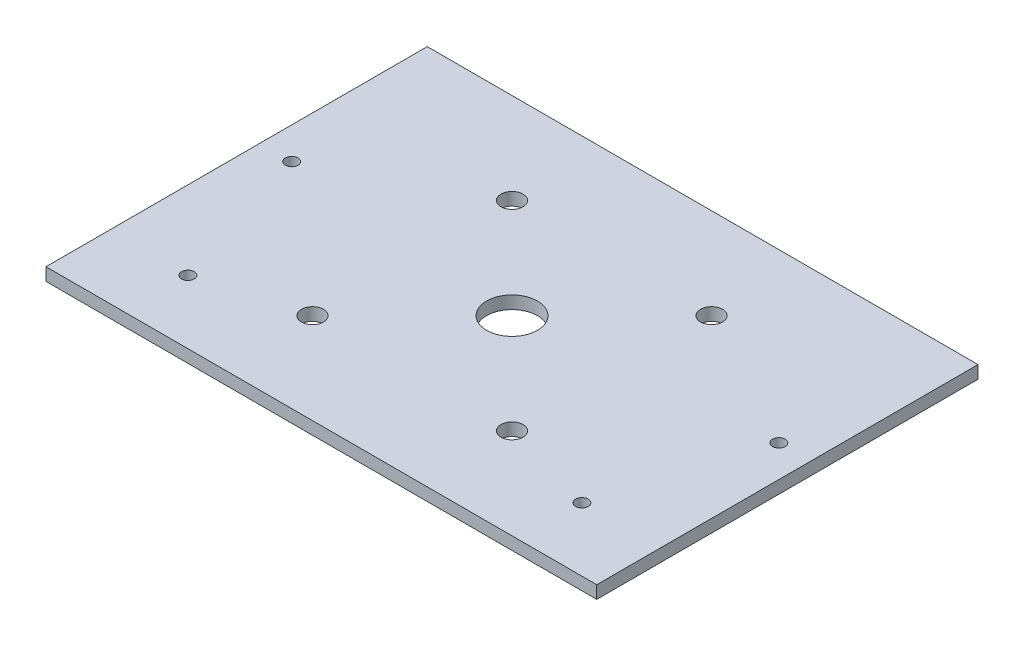
ISO-10303-21;
HEADER;
FILE_DESCRIPTION(('STEP AP214'),'2;1');
FILE_NAME('part.step','',(''),(''),'','','');
FILE_SCHEMA(('AUTOMOTIVE_DESIGN { 1 0 10303 214 1 1 1 1 }'));
ENDSEC;
DATA;
#1=APPLICATION_CONTEXT('core data for automotive mechanical design processes');
#2=APPLICATION_PROTOCOL_DEFINITION('international standard','automotive_design',2000,#1);
#3=PRODUCT_CONTEXT('',#1,'mechanical');
#4=PRODUCT('Part','Part','',(#3));
#5=PRODUCT_RELATED_PRODUCT_CATEGORY('part','',(#4));
#6=PRODUCT_DEFINITION_FORMATION('','',#4);
#7=PRODUCT_DEFINITION_CONTEXT('part definition',#1,'design');
#8=PRODUCT_DEFINITION('design','',#6,#7);
#9=PRODUCT_DEFINITION_SHAPE('','',#8);
#10=(LENGTH_UNIT() NAMED_UNIT(*) SI_UNIT(.MILLI.,.METRE.));
#11=(NAMED_UNIT(*) PLANE_ANGLE_UNIT() SI_UNIT($,.RADIAN.));
#12=(NAMED_UNIT(*) SI_UNIT($,.STERADIAN.) SOLID_ANGLE_UNIT());
#13=UNCERTAINTY_MEASURE_WITH_UNIT(LENGTH_MEASURE(1.E-05),#10,'distance_accuracy_value','');
#14=(GEOMETRIC_REPRESENTATION_CONTEXT(3) GLOBAL_UNCERTAINTY_ASSIGNED_CONTEXT((#13)) GLOBAL_UNIT_ASSIGNED_CONTEXT((#10,
#11,#12)) REPRESENTATION_CONTEXT('',''));
#15=CARTESIAN_POINT('',(0.,0.,0.));
#16=DIRECTION('',(0.,0.,1.));
#17=DIRECTION('',(1.,0.,0.));
#18=AXIS2_PLACEMENT_3D('',#15,#16,#17);
#19=CARTESIAN_POINT('',(65.,3.,-45.));
#20=DIRECTION('',(-1.,0.,0.));
#21=DIRECTION('',(0.,0.,1.));
#22=AXIS2_PLACEMENT_3D('',#19,#20,#21);
#23=PLANE('',#22);
#24=DIRECTION('',(0.,0.,-1.));
#25=VECTOR('',#24,1.);
#26=CARTESIAN_POINT('',(65.,0.,-45.));
#27=LINE('',#26,#25);
#28=CARTESIAN_POINT('',(65.,0.,45.));
#29=VERTEX_POINT('',#28);
#30=CARTESIAN_POINT('',(65.,0.,-45.));
#31=VERTEX_POINT('',#30);
#32=EDGE_CURVE('E99',#29,#31,#27,.T.);
#33=ORIENTED_EDGE('',*,*,#32,.T.);
#34=DIRECTION('',(0.,-1.,0.));
#35=VECTOR('',#34,1.);
#36=CARTESIAN_POINT('',(65.,3.,-45.));
#37=LINE('',#36,#35);
#38=CARTESIAN_POINT('',(65.,3.,-45.));
#39=VERTEX_POINT('',#38);
#40=EDGE_CURVE('E11',#39,#31,#37,.T.);
#41=ORIENTED_EDGE('',*,*,#40,.F.);
#42=DIRECTION('',(0.,0.,-1.));
#43=VECTOR('',#42,1.);
#44=CARTESIAN_POINT('',(65.,3.,-45.));
#45=LINE('',#44,#43);
#46=CARTESIAN_POINT('',(65.,3.,45.));
#47=VERTEX_POINT('',#46);
#48=EDGE_CURVE('E86',#47,#39,#45,.T.);
#49=ORIENTED_EDGE('',*,*,#48,.F.);
#50=DIRECTION('',(0.,-1.,0.));
#51=VECTOR('',#50,1.);
#52=CARTESIAN_POINT('',(65.,3.,45.));
#53=LINE('',#52,#51);
#54=EDGE_CURVE('E95',#47,#29,#53,.T.);
#55=ORIENTED_EDGE('',*,*,#54,.T.);
#56=EDGE_LOOP('',(#33,#41,#49,#55));
#57=FACE_BOUND('',#56,.T.);
#58=ADVANCED_FACE('F33',(#57),#23,.F.);
#59=CARTESIAN_POINT('',(-65.,3.,-45.));
#60=DIRECTION('',(0.,0.,1.));
#61=DIRECTION('',(1.,0.,0.));
#62=AXIS2_PLACEMENT_3D('',#59,#60,#61);
#63=PLANE('',#62);
#64=DIRECTION('',(-1.,0.,0.));
#65=VECTOR('',#64,1.);
#66=CARTESIAN_POINT('',(-65.,0.,-45.));
#67=LINE('',#66,#65);
#68=CARTESIAN_POINT('',(-65.,0.,-45.));
#69=VERTEX_POINT('',#68);
#70=EDGE_CURVE('E90',#31,#69,#67,.T.);
#71=ORIENTED_EDGE('',*,*,#70,.T.);
#72=DIRECTION('',(0.,-1.,0.));
#73=VECTOR('',#72,1.);
#74=CARTESIAN_POINT('',(-65.,3.,-45.));
#75=LINE('',#74,#73);
#76=CARTESIAN_POINT('',(-65.,3.,-45.));
#77=VERTEX_POINT('',#76);
#78=EDGE_CURVE('E42',#77,#69,#75,.T.);
#79=ORIENTED_EDGE('',*,*,#78,.F.);
#80=DIRECTION('',(-1.,0.,0.));
#81=VECTOR('',#80,1.);
#82=CARTESIAN_POINT('',(-65.,3.,-45.));
#83=LINE('',#82,#81);
#84=EDGE_CURVE('E81',#39,#77,#83,.T.);
#85=ORIENTED_EDGE('',*,*,#84,.F.);
#86=ORIENTED_EDGE('',*,*,#40,.T.);
#87=EDGE_LOOP('',(#71,#79,#85,#86));
#88=FACE_BOUND('',#87,.T.);
#89=ADVANCED_FACE('F89',(#88),#63,.F.);
#90=CARTESIAN_POINT('',(-65.,3.,-45.));
#91=DIRECTION('',(1.,0.,0.));
#92=DIRECTION('',(0.,0.,-1.));
#93=AXIS2_PLACEMENT_3D('',#90,#91,#92);
#94=PLANE('',#93);
#95=DIRECTION('',(0.,0.,1.));
#96=VECTOR('',#95,1.);
#97=CARTESIAN_POINT('',(-65.,0.,-45.));
#98=LINE('',#97,#96);
#99=CARTESIAN_POINT('',(-65.,0.,45.));
#100=VERTEX_POINT('',#99);
#101=EDGE_CURVE('E68',#69,#100,#98,.T.);
#102=ORIENTED_EDGE('',*,*,#101,.T.);
#103=DIRECTION('',(0.,-1.,0.));
#104=VECTOR('',#103,1.);
#105=CARTESIAN_POINT('',(-65.,3.,45.));
#106=LINE('',#105,#104);
#107=CARTESIAN_POINT('',(-65.,3.,45.));
#108=VERTEX_POINT('',#107);
#109=EDGE_CURVE('E91',#108,#100,#106,.T.);
#110=ORIENTED_EDGE('',*,*,#109,.F.);
#111=DIRECTION('',(0.,0.,1.));
#112=VECTOR('',#111,1.);
#113=CARTESIAN_POINT('',(-65.,3.,-45.));
#114=LINE('',#113,#112);
#115=EDGE_CURVE('E84',#77,#108,#114,.T.);
#116=ORIENTED_EDGE('',*,*,#115,.F.);
#117=ORIENTED_EDGE('',*,*,#78,.T.);
#118=EDGE_LOOP('',(#102,#110,#116,#117));
#119=FACE_BOUND('',#118,.T.);
#120=ADVANCED_FACE('F93',(#119),#94,.F.);
#121=CARTESIAN_POINT('',(-65.,3.,45.));
#122=DIRECTION('',(0.,0.,-1.));
#123=DIRECTION('',(-1.,0.,0.));
#124=AXIS2_PLACEMENT_3D('',#121,#122,#123);
#125=PLANE('',#124);
#126=DIRECTION('',(1.,0.,0.));
#127=VECTOR('',#126,1.);
#128=CARTESIAN_POINT('',(-65.,0.,45.));
#129=LINE('',#128,#127);
#130=EDGE_CURVE('E74',#100,#29,#129,.T.);
#131=ORIENTED_EDGE('',*,*,#130,.T.);
#132=ORIENTED_EDGE('',*,*,#54,.F.);
#133=DIRECTION('',(1.,0.,0.));
#134=VECTOR('',#133,1.);
#135=CARTESIAN_POINT('',(-65.,3.,45.));
#136=LINE('',#135,#134);
#137=EDGE_CURVE('E51',#108,#47,#136,.T.);
#138=ORIENTED_EDGE('',*,*,#137,.F.);
#139=ORIENTED_EDGE('',*,*,#109,.T.);
#140=EDGE_LOOP('',(#131,#132,#138,#139));
#141=FACE_BOUND('',#140,.T.);
#142=ADVANCED_FACE('F138',(#141),#125,.F.);
#143=CARTESIAN_POINT('',(0.,3.,0.));
#144=DIRECTION('',(0.,1.,0.));
#145=DIRECTION('',(0.,0.,1.));
#146=AXIS2_PLACEMENT_3D('',#143,#144,#145);
#147=PLANE('',#146);
#148=CARTESIAN_POINT('',(0.,3.,0.));
#149=DIRECTION('',(0.,1.,0.));
#150=DIRECTION('',(0.,0.,1.));
#151=AXIS2_PLACEMENT_3D('',#148,#149,#150);
#152=CIRCLE('',#151,6.);
#153=CARTESIAN_POINT('',(0.,3.,6.));
#154=VERTEX_POINT('',#153);
#155=EDGE_CURVE('E270',#154,#154,#152,.T.);
#156=ORIENTED_EDGE('',*,*,#155,.F.);
#157=EDGE_LOOP('',(#156));
#158=FACE_BOUND('',#157,.T.);
#159=CARTESIAN_POINT('',(57.5,3.,-5.50000000000005));
#160=DIRECTION('',(0.,1.,0.));
#161=DIRECTION('',(0.,0.,1.));
#162=AXIS2_PLACEMENT_3D('',#159,#160,#161);
#163=CIRCLE('',#162,1.5);
#164=CARTESIAN_POINT('',(57.5,3.,-4.00000000000004));
#165=VERTEX_POINT('',#164);
#166=EDGE_CURVE('E280',#165,#165,#163,.T.);
#167=ORIENTED_EDGE('',*,*,#166,.F.);
#168=EDGE_LOOP('',(#167));
#169=FACE_BOUND('',#168,.T.);
#170=CARTESIAN_POINT('',(-57.5,3.,-5.50000000000005));
#171=DIRECTION('',(0.,1.,0.));
#172=DIRECTION('',(0.,0.,1.));
#173=AXIS2_PLACEMENT_3D('',#170,#171,#172);
#174=CIRCLE('',#173,1.5);
#175=CARTESIAN_POINT('',(-57.5,3.,-4.00000000000004));
#176=VERTEX_POINT('',#175);
#177=EDGE_CURVE('E286',#176,#176,#174,.T.);
#178=ORIENTED_EDGE('',*,*,#177,.F.);
#179=EDGE_LOOP('',(#178));
#180=FACE_BOUND('',#179,.T.);
#181=CARTESIAN_POINT('',(-46.5,3.,30.));
#182=DIRECTION('',(0.,1.,0.));
#183=DIRECTION('',(0.,0.,1.));
#184=AXIS2_PLACEMENT_3D('',#181,#182,#183);
#185=CIRCLE('',#184,1.5);
#186=CARTESIAN_POINT('',(-46.5,3.,31.5));
#187=VERTEX_POINT('',#186);
#188=EDGE_CURVE('E292',#187,#187,#185,.T.);
#189=ORIENTED_EDGE('',*,*,#188,.F.);
#190=EDGE_LOOP('',(#189));
#191=FACE_BOUND('',#190,.T.);
#192=CARTESIAN_POINT('',(46.5,3.,30.));
#193=DIRECTION('',(0.,1.,0.));
#194=DIRECTION('',(0.,0.,1.));
#195=AXIS2_PLACEMENT_3D('',#192,#193,#194);
#196=CIRCLE('',#195,1.5);
#197=CARTESIAN_POINT('',(46.5,3.,31.5));
#198=VERTEX_POINT('',#197);
#199=EDGE_CURVE('E297',#198,#198,#196,.T.);
#200=ORIENTED_EDGE('',*,*,#199,.F.);
#201=EDGE_LOOP('',(#200));
#202=FACE_BOUND('',#201,.T.);
#203=CARTESIAN_POINT('',(23.55,3.,-23.55));
#204=DIRECTION('',(0.,1.,0.));
#205=DIRECTION('',(0.,0.,1.));
#206=AXIS2_PLACEMENT_3D('',#203,#204,#205);
#207=CIRCLE('',#206,2.6);
#208=CARTESIAN_POINT('',(23.55,3.,-20.95));
#209=VERTEX_POINT('',#208);
#210=EDGE_CURVE('E126',#209,#209,#207,.T.);
#211=ORIENTED_EDGE('',*,*,#210,.F.);
#212=EDGE_LOOP('',(#211));
#213=FACE_BOUND('',#212,.T.);
#214=CARTESIAN_POINT('',(-23.55,3.,-23.55));
#215=DIRECTION('',(0.,1.,0.));
#216=DIRECTION('',(0.,0.,1.));
#217=AXIS2_PLACEMENT_3D('',#214,#215,#216);
#218=CIRCLE('',#217,2.6);
#219=CARTESIAN_POINT('',(-23.55,3.,-20.95));
#220=VERTEX_POINT('',#219);
#221=EDGE_CURVE('E116',#220,#220,#218,.T.);
#222=ORIENTED_EDGE('',*,*,#221,.F.);
#223=EDGE_LOOP('',(#222));
#224=FACE_BOUND('',#223,.T.);
#225=CARTESIAN_POINT('',(-23.55,3.,23.55));
#226=DIRECTION('',(0.,1.,0.));
#227=DIRECTION('',(0.,0.,1.));
#228=AXIS2_PLACEMENT_3D('',#225,#226,#227);
#229=CIRCLE('',#228,2.6);
#230=CARTESIAN_POINT('',(-23.55,3.,26.15));
#231=VERTEX_POINT('',#230);
#232=EDGE_CURVE('E113',#231,#231,#229,.T.);
#233=ORIENTED_EDGE('',*,*,#232,.F.);
#234=EDGE_LOOP('',(#233));
#235=FACE_BOUND('',#234,.T.);
#236=CARTESIAN_POINT('',(23.55,3.,23.55));
#237=DIRECTION('',(0.,1.,0.));
#238=DIRECTION('',(0.,0.,1.));
#239=AXIS2_PLACEMENT_3D('',#236,#237,#238);
#240=CIRCLE('',#239,2.6);
#241=CARTESIAN_POINT('',(23.55,3.,26.15));
#242=VERTEX_POINT('',#241);
#243=EDGE_CURVE('E110',#242,#242,#240,.T.);
#244=ORIENTED_EDGE('',*,*,#243,.F.);
#245=EDGE_LOOP('',(#244));
#246=FACE_BOUND('',#245,.T.);
#247=ORIENTED_EDGE('',*,*,#48,.T.);
#248=ORIENTED_EDGE('',*,*,#84,.T.);
#249=ORIENTED_EDGE('',*,*,#115,.T.);
#250=ORIENTED_EDGE('',*,*,#137,.T.);
#251=EDGE_LOOP('',(#247,#248,#249,#250));
#252=FACE_BOUND('',#251,.T.);
#253=ADVANCED_FACE('F82',(#158,#169,#180,#191,#202,#213,#224,#235,#246,#252),#147,.T.);
#254=CARTESIAN_POINT('',(0.,0.,0.));
#255=DIRECTION('',(0.,1.,0.));
#256=DIRECTION('',(0.,0.,1.));
#257=AXIS2_PLACEMENT_3D('',#254,#255,#256);
#258=PLANE('',#257);
#259=CARTESIAN_POINT('',(0.,0.,0.));
#260=DIRECTION('',(0.,-1.,0.));
#261=DIRECTION('',(0.,0.,-1.));
#262=AXIS2_PLACEMENT_3D('',#259,#260,#261);
#263=CIRCLE('',#262,6.);
#264=CARTESIAN_POINT('',(0.,0.,-6.));
#265=VERTEX_POINT('',#264);
#266=EDGE_CURVE('E273',#265,#265,#263,.T.);
#267=ORIENTED_EDGE('',*,*,#266,.F.);
#268=EDGE_LOOP('',(#267));
#269=FACE_BOUND('',#268,.T.);
#270=CARTESIAN_POINT('',(57.5,0.,-5.50000000000005));
#271=DIRECTION('',(0.,-1.,0.));
#272=DIRECTION('',(0.,0.,-1.));
#273=AXIS2_PLACEMENT_3D('',#270,#271,#272);
#274=CIRCLE('',#273,1.5);
#275=CARTESIAN_POINT('',(57.5,0.,-7.00000000000005));
#276=VERTEX_POINT('',#275);
#277=EDGE_CURVE('E275',#276,#276,#274,.T.);
#278=ORIENTED_EDGE('',*,*,#277,.F.);
#279=EDGE_LOOP('',(#278));
#280=FACE_BOUND('',#279,.T.);
#281=CARTESIAN_POINT('',(-57.5,0.,-5.50000000000005));
#282=DIRECTION('',(0.,-1.,0.));
#283=DIRECTION('',(0.,0.,-1.));
#284=AXIS2_PLACEMENT_3D('',#281,#282,#283);
#285=CIRCLE('',#284,1.5);
#286=CARTESIAN_POINT('',(-57.5,0.,-7.00000000000005));
#287=VERTEX_POINT('',#286);
#288=EDGE_CURVE('E283',#287,#287,#285,.T.);
#289=ORIENTED_EDGE('',*,*,#288,.F.);
#290=EDGE_LOOP('',(#289));
#291=FACE_BOUND('',#290,.T.);
#292=CARTESIAN_POINT('',(-46.5,0.,30.));
#293=DIRECTION('',(0.,-1.,0.));
#294=DIRECTION('',(0.,0.,-1.));
#295=AXIS2_PLACEMENT_3D('',#292,#293,#294);
#296=CIRCLE('',#295,1.5);
#297=CARTESIAN_POINT('',(-46.5,0.,28.5));
#298=VERTEX_POINT('',#297);
#299=EDGE_CURVE('E289',#298,#298,#296,.T.);
#300=ORIENTED_EDGE('',*,*,#299,.F.);
#301=EDGE_LOOP('',(#300));
#302=FACE_BOUND('',#301,.T.);
#303=CARTESIAN_POINT('',(46.5,0.,30.));
#304=DIRECTION('',(0.,-1.,0.));
#305=DIRECTION('',(0.,0.,-1.));
#306=AXIS2_PLACEMENT_3D('',#303,#304,#305);
#307=CIRCLE('',#306,1.5);
#308=CARTESIAN_POINT('',(46.5,0.,28.5));
#309=VERTEX_POINT('',#308);
#310=EDGE_CURVE('E295',#309,#309,#307,.T.);
#311=ORIENTED_EDGE('',*,*,#310,.F.);
#312=EDGE_LOOP('',(#311));
#313=FACE_BOUND('',#312,.T.);
#314=CARTESIAN_POINT('',(23.55,0.,-23.55));
#315=DIRECTION('',(0.,1.,0.));
#316=DIRECTION('',(0.,0.,1.));
#317=AXIS2_PLACEMENT_3D('',#314,#315,#316);
#318=CIRCLE('',#317,2.6);
#319=CARTESIAN_POINT('',(23.55,0.,-20.95));
#320=VERTEX_POINT('',#319);
#321=EDGE_CURVE('E36',#320,#320,#318,.T.);
#322=ORIENTED_EDGE('',*,*,#321,.T.);
#323=EDGE_LOOP('',(#322));
#324=FACE_BOUND('',#323,.T.);
#325=CARTESIAN_POINT('',(-23.55,0.,-23.55));
#326=DIRECTION('',(0.,1.,0.));
#327=DIRECTION('',(0.,0.,1.));
#328=AXIS2_PLACEMENT_3D('',#325,#326,#327);
#329=CIRCLE('',#328,2.6);
#330=CARTESIAN_POINT('',(-23.55,0.,-20.95));
#331=VERTEX_POINT('',#330);
#332=EDGE_CURVE('E114',#331,#331,#329,.T.);
#333=ORIENTED_EDGE('',*,*,#332,.T.);
#334=EDGE_LOOP('',(#333));
#335=FACE_BOUND('',#334,.T.);
#336=CARTESIAN_POINT('',(-23.55,0.,23.55));
#337=DIRECTION('',(0.,1.,0.));
#338=DIRECTION('',(0.,0.,1.));
#339=AXIS2_PLACEMENT_3D('',#336,#337,#338);
#340=CIRCLE('',#339,2.6);
#341=CARTESIAN_POINT('',(-23.55,0.,26.15));
#342=VERTEX_POINT('',#341);
#343=EDGE_CURVE('E111',#342,#342,#340,.T.);
#344=ORIENTED_EDGE('',*,*,#343,.T.);
#345=EDGE_LOOP('',(#344));
#346=FACE_BOUND('',#345,.T.);
#347=CARTESIAN_POINT('',(23.55,0.,23.55));
#348=DIRECTION('',(0.,1.,0.));
#349=DIRECTION('',(0.,0.,1.));
#350=AXIS2_PLACEMENT_3D('',#347,#348,#349);
#351=CIRCLE('',#350,2.6);
#352=CARTESIAN_POINT('',(23.55,0.,26.15));
#353=VERTEX_POINT('',#352);
#354=EDGE_CURVE('E102',#353,#353,#351,.T.);
#355=ORIENTED_EDGE('',*,*,#354,.T.);
#356=EDGE_LOOP('',(#355));
#357=FACE_BOUND('',#356,.T.);
#358=ORIENTED_EDGE('',*,*,#32,.F.);
#359=ORIENTED_EDGE('',*,*,#130,.F.);
#360=ORIENTED_EDGE('',*,*,#101,.F.);
#361=ORIENTED_EDGE('',*,*,#70,.F.);
#362=EDGE_LOOP('',(#358,#359,#360,#361));
#363=FACE_BOUND('',#362,.T.);
#364=ADVANCED_FACE('F137',(#269,#280,#291,#302,#313,#324,#335,#346,#357,#363),#258,.F.);
#365=CARTESIAN_POINT('',(23.55,-7.,23.55));
#366=DIRECTION('',(0.,1.,0.));
#367=DIRECTION('',(0.,0.,1.));
#368=AXIS2_PLACEMENT_3D('',#365,#366,#367);
#369=CYLINDRICAL_SURFACE('',#368,2.6);
#370=ORIENTED_EDGE('',*,*,#243,.T.);
#371=EDGE_LOOP('',(#370));
#372=FACE_BOUND('',#371,.T.);
#373=ORIENTED_EDGE('',*,*,#354,.F.);
#374=EDGE_LOOP('',(#373));
#375=FACE_BOUND('',#374,.T.);
#376=ADVANCED_FACE('F133',(#372,#375),#369,.F.);
#377=CARTESIAN_POINT('',(-23.55,-7.,23.55));
#378=DIRECTION('',(0.,1.,0.));
#379=DIRECTION('',(0.,0.,1.));
#380=AXIS2_PLACEMENT_3D('',#377,#378,#379);
#381=CYLINDRICAL_SURFACE('',#380,2.6);
#382=ORIENTED_EDGE('',*,*,#232,.T.);
#383=EDGE_LOOP('',(#382));
#384=FACE_BOUND('',#383,.T.);
#385=ORIENTED_EDGE('',*,*,#343,.F.);
#386=EDGE_LOOP('',(#385));
#387=FACE_BOUND('',#386,.T.);
#388=ADVANCED_FACE('F178',(#384,#387),#381,.F.);
#389=CARTESIAN_POINT('',(-23.55,-7.,-23.55));
#390=DIRECTION('',(0.,1.,0.));
#391=DIRECTION('',(0.,0.,1.));
#392=AXIS2_PLACEMENT_3D('',#389,#390,#391);
#393=CYLINDRICAL_SURFACE('',#392,2.6);
#394=ORIENTED_EDGE('',*,*,#221,.T.);
#395=EDGE_LOOP('',(#394));
#396=FACE_BOUND('',#395,.T.);
#397=ORIENTED_EDGE('',*,*,#332,.F.);
#398=EDGE_LOOP('',(#397));
#399=FACE_BOUND('',#398,.T.);
#400=ADVANCED_FACE('F187',(#396,#399),#393,.F.);
#401=CARTESIAN_POINT('',(23.55,-7.,-23.55));
#402=DIRECTION('',(0.,1.,0.));
#403=DIRECTION('',(0.,0.,1.));
#404=AXIS2_PLACEMENT_3D('',#401,#402,#403);
#405=CYLINDRICAL_SURFACE('',#404,2.6);
#406=ORIENTED_EDGE('',*,*,#210,.T.);
#407=EDGE_LOOP('',(#406));
#408=FACE_BOUND('',#407,.T.);
#409=ORIENTED_EDGE('',*,*,#321,.F.);
#410=EDGE_LOOP('',(#409));
#411=FACE_BOUND('',#410,.T.);
#412=ADVANCED_FACE('F197',(#408,#411),#405,.F.);
#413=CARTESIAN_POINT('',(46.5,10.,30.));
#414=DIRECTION('',(0.,-1.,0.));
#415=DIRECTION('',(0.,0.,-1.));
#416=AXIS2_PLACEMENT_3D('',#413,#414,#415);
#417=CYLINDRICAL_SURFACE('',#416,1.5);
#418=ORIENTED_EDGE('',*,*,#199,.T.);
#419=EDGE_LOOP('',(#418));
#420=FACE_BOUND('',#419,.T.);
#421=ORIENTED_EDGE('',*,*,#310,.T.);
#422=EDGE_LOOP('',(#421));
#423=FACE_BOUND('',#422,.T.);
#424=ADVANCED_FACE('F206',(#420,#423),#417,.F.);
#425=CARTESIAN_POINT('',(-46.5,10.,30.));
#426=DIRECTION('',(0.,-1.,0.));
#427=DIRECTION('',(0.,0.,-1.));
#428=AXIS2_PLACEMENT_3D('',#425,#426,#427);
#429=CYLINDRICAL_SURFACE('',#428,1.5);
#430=ORIENTED_EDGE('',*,*,#188,.T.);
#431=EDGE_LOOP('',(#430));
#432=FACE_BOUND('',#431,.T.);
#433=ORIENTED_EDGE('',*,*,#299,.T.);
#434=EDGE_LOOP('',(#433));
#435=FACE_BOUND('',#434,.T.);
#436=ADVANCED_FACE('F216',(#432,#435),#429,.F.);
#437=CARTESIAN_POINT('',(-57.5,10.,-5.50000000000005));
#438=DIRECTION('',(0.,-1.,0.));
#439=DIRECTION('',(0.,0.,-1.));
#440=AXIS2_PLACEMENT_3D('',#437,#438,#439);
#441=CYLINDRICAL_SURFACE('',#440,1.5);
#442=ORIENTED_EDGE('',*,*,#177,.T.);
#443=EDGE_LOOP('',(#442));
#444=FACE_BOUND('',#443,.T.);
#445=ORIENTED_EDGE('',*,*,#288,.T.);
#446=EDGE_LOOP('',(#445));
#447=FACE_BOUND('',#446,.T.);
#448=ADVANCED_FACE('F226',(#444,#447),#441,.F.);
#449=CARTESIAN_POINT('',(57.5,10.,-5.50000000000005));
#450=DIRECTION('',(0.,-1.,0.));
#451=DIRECTION('',(0.,0.,-1.));
#452=AXIS2_PLACEMENT_3D('',#449,#450,#451);
#453=CYLINDRICAL_SURFACE('',#452,1.5);
#454=ORIENTED_EDGE('',*,*,#166,.T.);
#455=EDGE_LOOP('',(#454));
#456=FACE_BOUND('',#455,.T.);
#457=ORIENTED_EDGE('',*,*,#277,.T.);
#458=EDGE_LOOP('',(#457));
#459=FACE_BOUND('',#458,.T.);
#460=ADVANCED_FACE('F236',(#456,#459),#453,.F.);
#461=CARTESIAN_POINT('',(0.,10.,0.));
#462=DIRECTION('',(0.,-1.,0.));
#463=DIRECTION('',(0.,0.,-1.));
#464=AXIS2_PLACEMENT_3D('',#461,#462,#463);
#465=CYLINDRICAL_SURFACE('',#464,6.);
#466=ORIENTED_EDGE('',*,*,#155,.T.);
#467=EDGE_LOOP('',(#466));
#468=FACE_BOUND('',#467,.T.);
#469=ORIENTED_EDGE('',*,*,#266,.T.);
#470=EDGE_LOOP('',(#469));
#471=FACE_BOUND('',#470,.T.);
#472=ADVANCED_FACE('F245',(#468,#471),#465,.F.);
#473=CLOSED_SHELL('',(#58,#89,#120,#142,#253,#364,#376,#388,#400,#412,#424,#436,#448,#460,#472));
#474=MANIFOLD_SOLID_BREP('B2',#473);
#475=ADVANCED_BREP_SHAPE_REPRESENTATION('',(#18,#474),#14);
#476=SHAPE_DEFINITION_REPRESENTATION(#9,#475);
ENDSEC;
END-ISO-10303-21;
